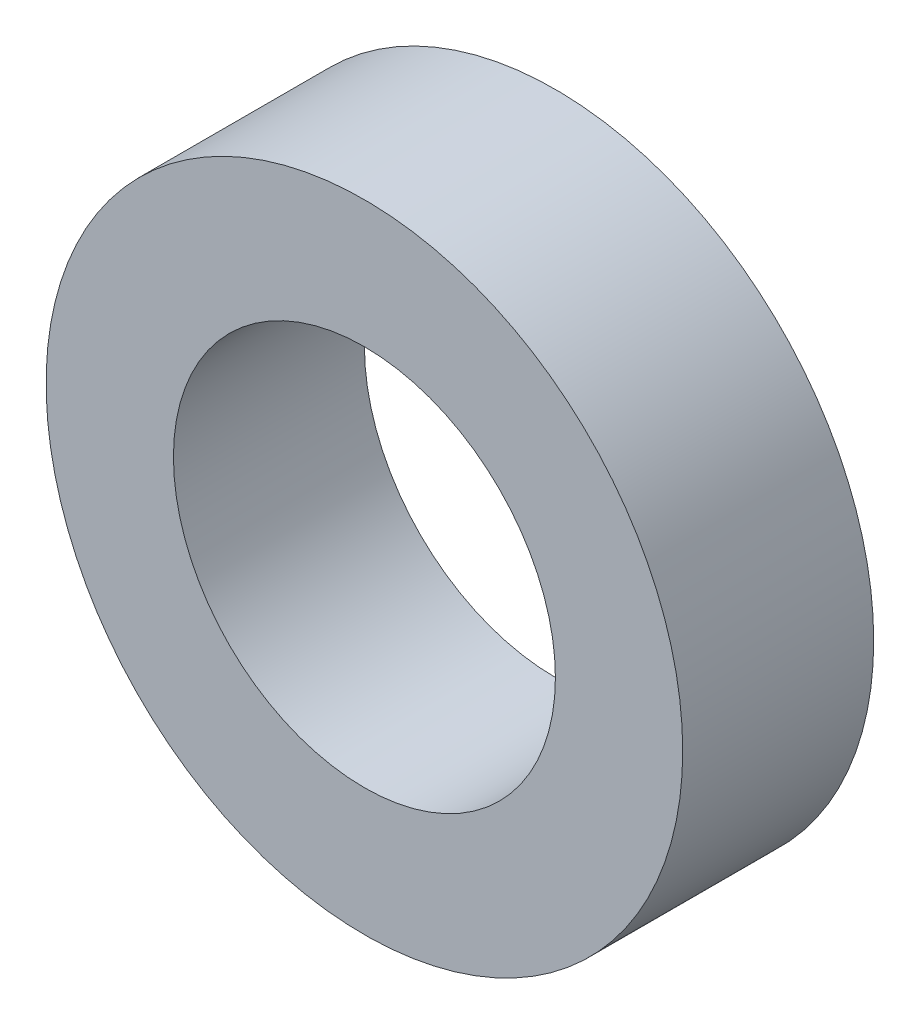
ISO-10303-21;
HEADER;
FILE_DESCRIPTION(('STEP AP214'),'2;1');
FILE_NAME('part.step','',(''),(''),'','','');
FILE_SCHEMA(('AUTOMOTIVE_DESIGN { 1 0 10303 214 1 1 1 1 }'));
ENDSEC;
DATA;
#1=APPLICATION_CONTEXT('core data for automotive mechanical design processes');
#2=APPLICATION_PROTOCOL_DEFINITION('international standard','automotive_design',2000,#1);
#3=PRODUCT_CONTEXT('',#1,'mechanical');
#4=PRODUCT('Part','Part','',(#3));
#5=PRODUCT_RELATED_PRODUCT_CATEGORY('part','',(#4));
#6=PRODUCT_DEFINITION_FORMATION('','',#4);
#7=PRODUCT_DEFINITION_CONTEXT('part definition',#1,'design');
#8=PRODUCT_DEFINITION('design','',#6,#7);
#9=PRODUCT_DEFINITION_SHAPE('','',#8);
#10=(LENGTH_UNIT() NAMED_UNIT(*) SI_UNIT(.MILLI.,.METRE.));
#11=(NAMED_UNIT(*) PLANE_ANGLE_UNIT() SI_UNIT($,.RADIAN.));
#12=(NAMED_UNIT(*) SI_UNIT($,.STERADIAN.) SOLID_ANGLE_UNIT());
#13=UNCERTAINTY_MEASURE_WITH_UNIT(LENGTH_MEASURE(1.E-05),#10,'distance_accuracy_value','');
#14=(GEOMETRIC_REPRESENTATION_CONTEXT(3) GLOBAL_UNCERTAINTY_ASSIGNED_CONTEXT((#13)) GLOBAL_UNIT_ASSIGNED_CONTEXT((#10,
#11,#12)) REPRESENTATION_CONTEXT('',''));
#15=CARTESIAN_POINT('',(0.,0.,0.));
#16=DIRECTION('',(0.,0.,1.));
#17=DIRECTION('',(1.,0.,0.));
#18=AXIS2_PLACEMENT_3D('',#15,#16,#17);
#19=CARTESIAN_POINT('',(0.,0.,15.));
#20=DIRECTION('',(0.,0.,1.));
#21=DIRECTION('',(1.,0.,0.));
#22=AXIS2_PLACEMENT_3D('',#19,#20,#21);
#23=PLANE('',#22);
#24=CARTESIAN_POINT('',(0.,0.,15.));
#25=DIRECTION('',(0.,0.,1.));
#26=DIRECTION('',(1.,0.,0.));
#27=AXIS2_PLACEMENT_3D('',#24,#25,#26);
#28=CIRCLE('',#27,25.);
#29=CARTESIAN_POINT('',(25.,0.,15.));
#30=VERTEX_POINT('',#29);
#31=EDGE_CURVE('E10',#30,#30,#28,.T.);
#32=ORIENTED_EDGE('',*,*,#31,.T.);
#33=EDGE_LOOP('',(#32));
#34=FACE_BOUND('',#33,.T.);
#35=CARTESIAN_POINT('',(0.,0.,15.));
#36=DIRECTION('',(0.,0.,1.));
#37=DIRECTION('',(1.,0.,0.));
#38=AXIS2_PLACEMENT_3D('',#35,#36,#37);
#39=CIRCLE('',#38,15.);
#40=CARTESIAN_POINT('',(15.,0.,15.));
#41=VERTEX_POINT('',#40);
#42=EDGE_CURVE('E46',#41,#41,#39,.T.);
#43=ORIENTED_EDGE('',*,*,#42,.F.);
#44=EDGE_LOOP('',(#43));
#45=FACE_BOUND('',#44,.T.);
#46=ADVANCED_FACE('F35',(#34,#45),#23,.T.);
#47=CARTESIAN_POINT('',(0.,0.,0.));
#48=DIRECTION('',(0.,0.,1.));
#49=DIRECTION('',(1.,0.,0.));
#50=AXIS2_PLACEMENT_3D('',#47,#48,#49);
#51=PLANE('',#50);
#52=CARTESIAN_POINT('',(0.,0.,0.));
#53=DIRECTION('',(0.,0.,1.));
#54=DIRECTION('',(1.,0.,0.));
#55=AXIS2_PLACEMENT_3D('',#52,#53,#54);
#56=CIRCLE('',#55,25.);
#57=CARTESIAN_POINT('',(25.,0.,0.));
#58=VERTEX_POINT('',#57);
#59=EDGE_CURVE('E39',#58,#58,#56,.T.);
#60=ORIENTED_EDGE('',*,*,#59,.F.);
#61=EDGE_LOOP('',(#60));
#62=FACE_BOUND('',#61,.T.);
#63=CARTESIAN_POINT('',(0.,0.,0.));
#64=DIRECTION('',(0.,0.,1.));
#65=DIRECTION('',(1.,0.,0.));
#66=AXIS2_PLACEMENT_3D('',#63,#64,#65);
#67=CIRCLE('',#66,15.);
#68=CARTESIAN_POINT('',(15.,0.,0.));
#69=VERTEX_POINT('',#68);
#70=EDGE_CURVE('E48',#69,#69,#67,.T.);
#71=ORIENTED_EDGE('',*,*,#70,.T.);
#72=EDGE_LOOP('',(#71));
#73=FACE_BOUND('',#72,.T.);
#74=ADVANCED_FACE('F58',(#62,#73),#51,.F.);
#75=CARTESIAN_POINT('',(0.,0.,15.));
#76=DIRECTION('',(0.,0.,-1.));
#77=DIRECTION('',(-1.,0.,0.));
#78=AXIS2_PLACEMENT_3D('',#75,#76,#77);
#79=CYLINDRICAL_SURFACE('',#78,25.);
#80=ORIENTED_EDGE('',*,*,#31,.F.);
#81=EDGE_LOOP('',(#80));
#82=FACE_BOUND('',#81,.T.);
#83=ORIENTED_EDGE('',*,*,#59,.T.);
#84=EDGE_LOOP('',(#83));
#85=FACE_BOUND('',#84,.T.);
#86=ADVANCED_FACE('F37',(#82,#85),#79,.T.);
#87=CARTESIAN_POINT('',(0.,0.,15.));
#88=DIRECTION('',(0.,0.,-1.));
#89=DIRECTION('',(-1.,0.,0.));
#90=AXIS2_PLACEMENT_3D('',#87,#88,#89);
#91=CYLINDRICAL_SURFACE('',#90,15.);
#92=ORIENTED_EDGE('',*,*,#42,.T.);
#93=EDGE_LOOP('',(#92));
#94=FACE_BOUND('',#93,.T.);
#95=ORIENTED_EDGE('',*,*,#70,.F.);
#96=EDGE_LOOP('',(#95));
#97=FACE_BOUND('',#96,.T.);
#98=ADVANCED_FACE('F54',(#94,#97),#91,.F.);
#99=CLOSED_SHELL('',(#46,#74,#86,#98));
#100=MANIFOLD_SOLID_BREP('B2',#99);
#101=ADVANCED_BREP_SHAPE_REPRESENTATION('',(#18,#100),#14);
#102=SHAPE_DEFINITION_REPRESENTATION(#9,#101);
ENDSEC;
END-ISO-10303-21;
